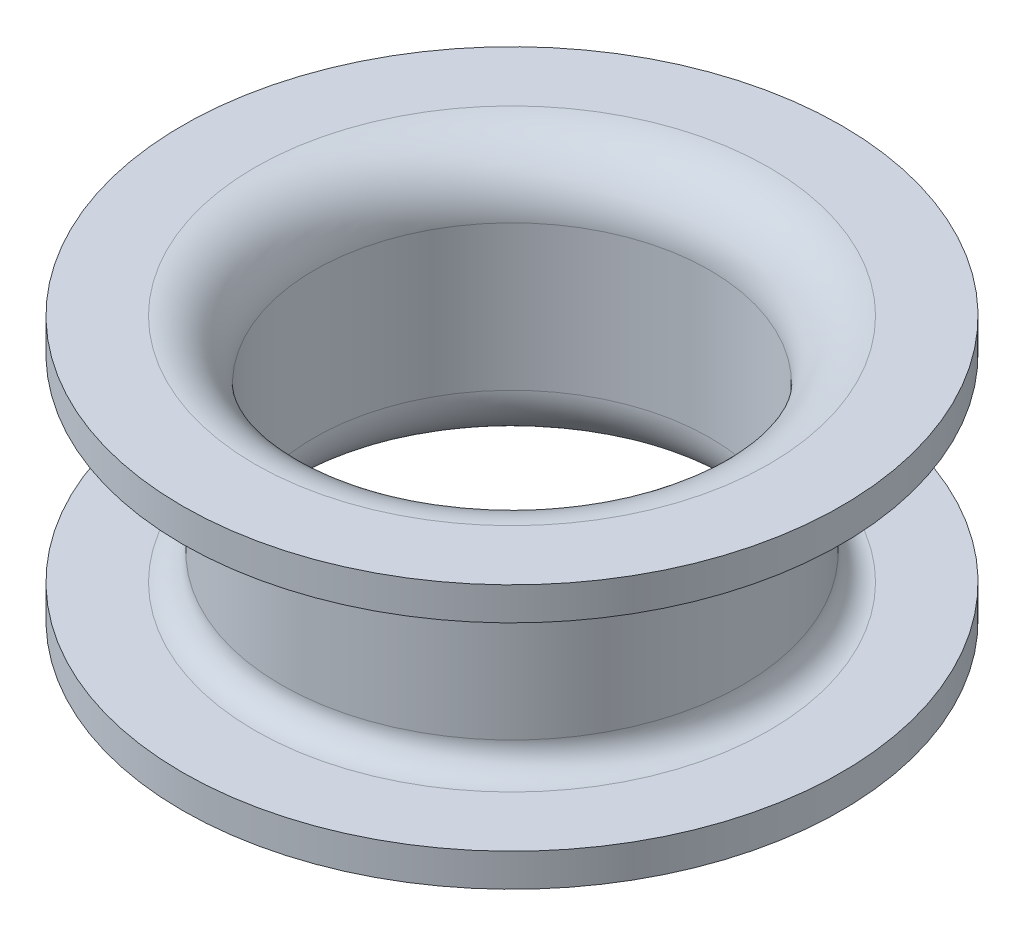
ISO-10303-21;
HEADER;
FILE_DESCRIPTION(('STEP AP214'),'2;1');
FILE_NAME('part.step','',(''),(''),'','','');
FILE_SCHEMA(('AUTOMOTIVE_DESIGN { 1 0 10303 214 1 1 1 1 }'));
ENDSEC;
DATA;
#1=APPLICATION_CONTEXT('core data for automotive mechanical design processes');
#2=APPLICATION_PROTOCOL_DEFINITION('international standard','automotive_design',2000,#1);
#3=PRODUCT_CONTEXT('',#1,'mechanical');
#4=PRODUCT('Part','Part','',(#3));
#5=PRODUCT_RELATED_PRODUCT_CATEGORY('part','',(#4));
#6=PRODUCT_DEFINITION_FORMATION('','',#4);
#7=PRODUCT_DEFINITION_CONTEXT('part definition',#1,'design');
#8=PRODUCT_DEFINITION('design','',#6,#7);
#9=PRODUCT_DEFINITION_SHAPE('','',#8);
#10=(LENGTH_UNIT() NAMED_UNIT(*) SI_UNIT(.MILLI.,.METRE.));
#11=(NAMED_UNIT(*) PLANE_ANGLE_UNIT() SI_UNIT($,.RADIAN.));
#12=(NAMED_UNIT(*) SI_UNIT($,.STERADIAN.) SOLID_ANGLE_UNIT());
#13=UNCERTAINTY_MEASURE_WITH_UNIT(LENGTH_MEASURE(1.E-05),#10,'distance_accuracy_value','');
#14=(GEOMETRIC_REPRESENTATION_CONTEXT(3) GLOBAL_UNCERTAINTY_ASSIGNED_CONTEXT((#13)) GLOBAL_UNIT_ASSIGNED_CONTEXT((#10,
#11,#12)) REPRESENTATION_CONTEXT('',''));
#15=CARTESIAN_POINT('',(0.,0.,0.));
#16=DIRECTION('',(0.,0.,1.));
#17=DIRECTION('',(1.,0.,0.));
#18=AXIS2_PLACEMENT_3D('',#15,#16,#17);
#19=CARTESIAN_POINT('',(2023.3225102,606.999145466001,805.722666406004));
#20=DIRECTION('',(0.,-1.,0.));
#21=DIRECTION('',(0.,0.,-1.));
#22=AXIS2_PLACEMENT_3D('',#19,#20,#21);
#23=CYLINDRICAL_SURFACE('',#22,10.0000000000016);
#24=CARTESIAN_POINT('',(2023.3225102,606.999145466001,805.722666406004));
#25=DIRECTION('',(0.,-1.,0.));
#26=DIRECTION('',(0.,0.,-1.));
#27=AXIS2_PLACEMENT_3D('',#24,#25,#26);
#28=CIRCLE('',#27,10.0000000000011);
#29=CARTESIAN_POINT('',(2023.3225102,606.999145466001,795.722666406003));
#30=VERTEX_POINT('',#29);
#31=EDGE_CURVE('E64',#30,#30,#28,.T.);
#32=ORIENTED_EDGE('',*,*,#31,.T.);
#33=EDGE_LOOP('',(#32));
#34=FACE_BOUND('',#33,.T.);
#35=CARTESIAN_POINT('',(2023.3225102,605.999145466,805.722666406004));
#36=DIRECTION('',(0.,-1.,0.));
#37=DIRECTION('',(0.,0.,-1.));
#38=AXIS2_PLACEMENT_3D('',#35,#36,#37);
#39=CIRCLE('',#38,10.000000000002);
#40=CARTESIAN_POINT('',(2023.3225102,605.999145466,795.722666406002));
#41=VERTEX_POINT('',#40);
#42=EDGE_CURVE('E73',#41,#41,#39,.T.);
#43=ORIENTED_EDGE('',*,*,#42,.F.);
#44=EDGE_LOOP('',(#43));
#45=FACE_BOUND('',#44,.T.);
#46=ADVANCED_FACE('F33',(#34,#45),#23,.T.);
#47=CARTESIAN_POINT('',(2033.3225102,606.999145466001,805.722666406004));
#48=DIRECTION('',(0.,1.,0.));
#49=DIRECTION('',(0.,0.,1.));
#50=AXIS2_PLACEMENT_3D('',#47,#48,#49);
#51=PLANE('',#50);
#52=CARTESIAN_POINT('',(2023.3225102,606.999145466001,805.722666406002));
#53=DIRECTION('',(0.,1.,0.));
#54=DIRECTION('',(0.,0.,1.));
#55=AXIS2_PLACEMENT_3D('',#52,#53,#54);
#56=CIRCLE('',#55,7.79999999999978);
#57=CARTESIAN_POINT('',(2023.3225102,606.999145466001,813.522666406002));
#58=VERTEX_POINT('',#57);
#59=EDGE_CURVE('E39',#58,#58,#56,.F.);
#60=ORIENTED_EDGE('',*,*,#59,.T.);
#61=EDGE_LOOP('',(#60));
#62=FACE_BOUND('',#61,.T.);
#63=ORIENTED_EDGE('',*,*,#31,.F.);
#64=EDGE_LOOP('',(#63));
#65=FACE_BOUND('',#64,.T.);
#66=ADVANCED_FACE('F80',(#62,#65),#51,.T.);
#67=CARTESIAN_POINT('',(2023.3225102,598.999145466001,805.722666406004));
#68=DIRECTION('',(0.,-1.,0.));
#69=DIRECTION('',(0.,0.,-1.));
#70=AXIS2_PLACEMENT_3D('',#67,#68,#69);
#71=PLANE('',#70);
#72=CARTESIAN_POINT('',(2023.3225102,598.999145466001,805.722666406002));
#73=DIRECTION('',(0.,-1.,0.));
#74=DIRECTION('',(0.,0.,-1.));
#75=AXIS2_PLACEMENT_3D('',#72,#73,#74);
#76=CIRCLE('',#75,7.79999999999978);
#77=CARTESIAN_POINT('',(2023.3225102,598.999145466001,797.922666406002));
#78=VERTEX_POINT('',#77);
#79=EDGE_CURVE('E10',#78,#78,#76,.F.);
#80=ORIENTED_EDGE('',*,*,#79,.T.);
#81=EDGE_LOOP('',(#80));
#82=FACE_BOUND('',#81,.T.);
#83=CARTESIAN_POINT('',(2023.3225102,598.999145466001,805.722666406004));
#84=DIRECTION('',(0.,-1.,0.));
#85=DIRECTION('',(0.,0.,-1.));
#86=AXIS2_PLACEMENT_3D('',#83,#84,#85);
#87=CIRCLE('',#86,10.0000000000002);
#88=CARTESIAN_POINT('',(2023.3225102,598.999145466001,795.722666406004));
#89=VERTEX_POINT('',#88);
#90=EDGE_CURVE('E67',#89,#89,#87,.T.);
#91=ORIENTED_EDGE('',*,*,#90,.T.);
#92=EDGE_LOOP('',(#91));
#93=FACE_BOUND('',#92,.T.);
#94=ADVANCED_FACE('F85',(#82,#93),#71,.T.);
#95=CARTESIAN_POINT('',(2023.3225102,606.999145466001,805.722666406004));
#96=DIRECTION('',(0.,-1.,0.));
#97=DIRECTION('',(0.,0.,-1.));
#98=AXIS2_PLACEMENT_3D('',#95,#96,#97);
#99=CYLINDRICAL_SURFACE('',#98,10.0000000000002);
#100=CARTESIAN_POINT('',(2023.3225102,599.999145466,805.722666406004));
#101=DIRECTION('',(0.,-1.,0.));
#102=DIRECTION('',(0.,0.,-1.));
#103=AXIS2_PLACEMENT_3D('',#100,#101,#102);
#104=CIRCLE('',#103,10.0000000000002);
#105=CARTESIAN_POINT('',(2023.3225102,599.999145466,795.722666406004));
#106=VERTEX_POINT('',#105);
#107=EDGE_CURVE('E70',#106,#106,#104,.T.);
#108=ORIENTED_EDGE('',*,*,#107,.T.);
#109=EDGE_LOOP('',(#108));
#110=FACE_BOUND('',#109,.T.);
#111=ORIENTED_EDGE('',*,*,#90,.F.);
#112=EDGE_LOOP('',(#111));
#113=FACE_BOUND('',#112,.T.);
#114=ADVANCED_FACE('F91',(#110,#113),#99,.T.);
#115=CARTESIAN_POINT('',(2033.3225102,599.999145466,805.722666406004));
#116=DIRECTION('',(0.,1.,0.));
#117=DIRECTION('',(0.,0.,1.));
#118=AXIS2_PLACEMENT_3D('',#115,#116,#117);
#119=PLANE('',#118);
#120=CARTESIAN_POINT('',(2023.3225102,599.999145466,805.722666406004));
#121=DIRECTION('',(0.,1.,0.));
#122=DIRECTION('',(0.,0.,1.));
#123=AXIS2_PLACEMENT_3D('',#120,#121,#122);
#124=CIRCLE('',#123,7.80000000000101);
#125=CARTESIAN_POINT('',(2023.3225102,599.999145466,813.522666406005));
#126=VERTEX_POINT('',#125);
#127=EDGE_CURVE('E61',#126,#126,#124,.F.);
#128=ORIENTED_EDGE('',*,*,#127,.T.);
#129=EDGE_LOOP('',(#128));
#130=FACE_BOUND('',#129,.T.);
#131=ORIENTED_EDGE('',*,*,#107,.F.);
#132=EDGE_LOOP('',(#131));
#133=FACE_BOUND('',#132,.T.);
#134=ADVANCED_FACE('F96',(#130,#133),#119,.T.);
#135=CARTESIAN_POINT('',(2023.3225102,606.999145466001,805.722666406004));
#136=DIRECTION('',(0.,-1.,0.));
#137=DIRECTION('',(0.,0.,-1.));
#138=AXIS2_PLACEMENT_3D('',#135,#136,#137);
#139=CYLINDRICAL_SURFACE('',#138,7.00000000000101);
#140=CARTESIAN_POINT('',(2023.3225102,600.799145466,805.722666406004));
#141=DIRECTION('',(0.,1.,0.));
#142=DIRECTION('',(0.,0.,1.));
#143=AXIS2_PLACEMENT_3D('',#140,#141,#142);
#144=CIRCLE('',#143,7.00000000000101);
#145=CARTESIAN_POINT('',(2023.3225102,600.799145466,812.722666406005));
#146=VERTEX_POINT('',#145);
#147=EDGE_CURVE('E55',#146,#146,#144,.T.);
#148=ORIENTED_EDGE('',*,*,#147,.T.);
#149=EDGE_LOOP('',(#148));
#150=FACE_BOUND('',#149,.T.);
#151=CARTESIAN_POINT('',(2023.3225102,605.199145466,805.722666406004));
#152=DIRECTION('',(0.,-1.,0.));
#153=DIRECTION('',(0.,0.,-1.));
#154=AXIS2_PLACEMENT_3D('',#151,#152,#153);
#155=CIRCLE('',#154,7.00000000000101);
#156=CARTESIAN_POINT('',(2023.3225102,605.199145466,798.722666406003));
#157=VERTEX_POINT('',#156);
#158=EDGE_CURVE('E58',#157,#157,#155,.T.);
#159=ORIENTED_EDGE('',*,*,#158,.T.);
#160=EDGE_LOOP('',(#159));
#161=FACE_BOUND('',#160,.T.);
#162=ADVANCED_FACE('F100',(#150,#161),#139,.T.);
#163=CARTESIAN_POINT('',(2030.3225102,605.999145466,805.722666406004));
#164=DIRECTION('',(0.,-1.,0.));
#165=DIRECTION('',(0.,0.,-1.));
#166=AXIS2_PLACEMENT_3D('',#163,#164,#165);
#167=PLANE('',#166);
#168=CARTESIAN_POINT('',(2023.3225102,605.999145466,805.722666406004));
#169=DIRECTION('',(0.,-1.,0.));
#170=DIRECTION('',(0.,0.,-1.));
#171=AXIS2_PLACEMENT_3D('',#168,#169,#170);
#172=CIRCLE('',#171,7.80000000000101);
#173=CARTESIAN_POINT('',(2023.3225102,605.999145466,797.922666406003));
#174=VERTEX_POINT('',#173);
#175=EDGE_CURVE('E52',#174,#174,#172,.F.);
#176=ORIENTED_EDGE('',*,*,#175,.T.);
#177=EDGE_LOOP('',(#176));
#178=FACE_BOUND('',#177,.T.);
#179=ORIENTED_EDGE('',*,*,#42,.T.);
#180=EDGE_LOOP('',(#179));
#181=FACE_BOUND('',#180,.T.);
#182=ADVANCED_FACE('F77',(#178,#181),#167,.T.);
#183=CARTESIAN_POINT('',(2023.3225102,598.999145466001,805.722666406002));
#184=DIRECTION('',(0.,1.,0.));
#185=DIRECTION('',(0.,0.,1.));
#186=AXIS2_PLACEMENT_3D('',#183,#184,#185);
#187=CYLINDRICAL_SURFACE('',#186,5.99999999999978);
#188=CARTESIAN_POINT('',(2023.3225102,605.199145466001,805.722666406002));
#189=DIRECTION('',(0.,1.,0.));
#190=DIRECTION('',(0.,0.,1.));
#191=AXIS2_PLACEMENT_3D('',#188,#189,#190);
#192=CIRCLE('',#191,5.99999999999978);
#193=CARTESIAN_POINT('',(2023.3225102,605.199145466001,811.722666406002));
#194=VERTEX_POINT('',#193);
#195=EDGE_CURVE('E43',#194,#194,#192,.T.);
#196=ORIENTED_EDGE('',*,*,#195,.T.);
#197=EDGE_LOOP('',(#196));
#198=FACE_BOUND('',#197,.T.);
#199=CARTESIAN_POINT('',(2023.3225102,600.799145466001,805.722666406002));
#200=DIRECTION('',(0.,-1.,0.));
#201=DIRECTION('',(0.,0.,-1.));
#202=AXIS2_PLACEMENT_3D('',#199,#200,#201);
#203=CIRCLE('',#202,5.99999999999978);
#204=CARTESIAN_POINT('',(2023.3225102,600.799145466001,799.722666406003));
#205=VERTEX_POINT('',#204);
#206=EDGE_CURVE('E47',#205,#205,#203,.T.);
#207=ORIENTED_EDGE('',*,*,#206,.T.);
#208=EDGE_LOOP('',(#207));
#209=FACE_BOUND('',#208,.T.);
#210=ADVANCED_FACE('F107',(#198,#209),#187,.F.);
#211=CARTESIAN_POINT('',(2023.3225102,600.799145466,805.722666406004));
#212=DIRECTION('',(0.,1.,0.));
#213=DIRECTION('',(0.,0.,1.));
#214=AXIS2_PLACEMENT_3D('',#211,#212,#213);
#215=TOROIDAL_SURFACE('',#214,7.80000000000101,0.8);
#216=ORIENTED_EDGE('',*,*,#147,.F.);
#217=EDGE_LOOP('',(#216));
#218=FACE_BOUND('',#217,.T.);
#219=ORIENTED_EDGE('',*,*,#127,.F.);
#220=EDGE_LOOP('',(#219));
#221=FACE_BOUND('',#220,.T.);
#222=ADVANCED_FACE('F111',(#218,#221),#215,.F.);
#223=CARTESIAN_POINT('',(2023.3225102,605.199145466,805.722666406004));
#224=DIRECTION('',(0.,-1.,0.));
#225=DIRECTION('',(0.,0.,-1.));
#226=AXIS2_PLACEMENT_3D('',#223,#224,#225);
#227=TOROIDAL_SURFACE('',#226,7.80000000000101,0.8);
#228=ORIENTED_EDGE('',*,*,#175,.F.);
#229=EDGE_LOOP('',(#228));
#230=FACE_BOUND('',#229,.T.);
#231=ORIENTED_EDGE('',*,*,#158,.F.);
#232=EDGE_LOOP('',(#231));
#233=FACE_BOUND('',#232,.T.);
#234=ADVANCED_FACE('F115',(#230,#233),#227,.F.);
#235=CARTESIAN_POINT('',(2023.3225102,605.199145466001,805.722666406002));
#236=DIRECTION('',(0.,1.,0.));
#237=DIRECTION('',(0.,0.,1.));
#238=AXIS2_PLACEMENT_3D('',#235,#236,#237);
#239=TOROIDAL_SURFACE('',#238,7.79999999999978,1.8);
#240=ORIENTED_EDGE('',*,*,#59,.F.);
#241=EDGE_LOOP('',(#240));
#242=FACE_BOUND('',#241,.T.);
#243=ORIENTED_EDGE('',*,*,#195,.F.);
#244=EDGE_LOOP('',(#243));
#245=FACE_BOUND('',#244,.T.);
#246=ADVANCED_FACE('F119',(#242,#245),#239,.T.);
#247=CARTESIAN_POINT('',(2023.3225102,600.799145466001,805.722666406002));
#248=DIRECTION('',(0.,-1.,0.));
#249=DIRECTION('',(0.,0.,-1.));
#250=AXIS2_PLACEMENT_3D('',#247,#248,#249);
#251=TOROIDAL_SURFACE('',#250,7.79999999999978,1.8);
#252=ORIENTED_EDGE('',*,*,#206,.F.);
#253=EDGE_LOOP('',(#252));
#254=FACE_BOUND('',#253,.T.);
#255=ORIENTED_EDGE('',*,*,#79,.F.);
#256=EDGE_LOOP('',(#255));
#257=FACE_BOUND('',#256,.T.);
#258=ADVANCED_FACE('F123',(#254,#257),#251,.T.);
#259=CLOSED_SHELL('',(#46,#66,#94,#114,#134,#162,#182,#210,#222,#234,#246,#258));
#260=MANIFOLD_SOLID_BREP('B2',#259);
#261=ADVANCED_BREP_SHAPE_REPRESENTATION('',(#18,#260),#14);
#262=SHAPE_DEFINITION_REPRESENTATION(#9,#261);
ENDSEC;
END-ISO-10303-21;
